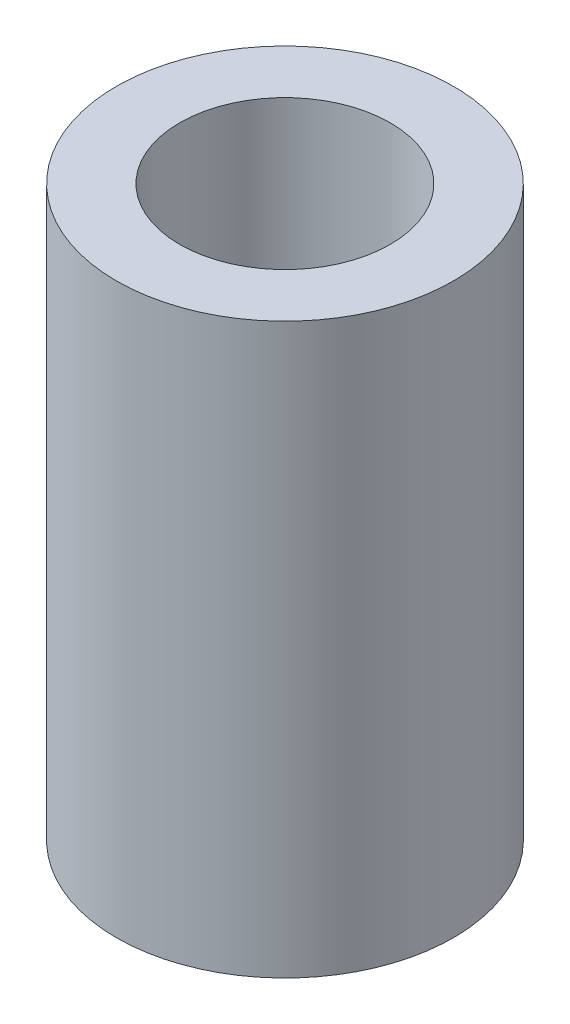
ISO-10303-21;
HEADER;
FILE_DESCRIPTION(('STEP AP214'),'2;1');
FILE_NAME('part.step','',(''),(''),'','','');
FILE_SCHEMA(('AUTOMOTIVE_DESIGN { 1 0 10303 214 1 1 1 1 }'));
ENDSEC;
DATA;
#1=APPLICATION_CONTEXT('core data for automotive mechanical design processes');
#2=APPLICATION_PROTOCOL_DEFINITION('international standard','automotive_design',2000,#1);
#3=PRODUCT_CONTEXT('',#1,'mechanical');
#4=PRODUCT('Part','Part','',(#3));
#5=PRODUCT_RELATED_PRODUCT_CATEGORY('part','',(#4));
#6=PRODUCT_DEFINITION_FORMATION('','',#4);
#7=PRODUCT_DEFINITION_CONTEXT('part definition',#1,'design');
#8=PRODUCT_DEFINITION('design','',#6,#7);
#9=PRODUCT_DEFINITION_SHAPE('','',#8);
#10=(LENGTH_UNIT() NAMED_UNIT(*) SI_UNIT(.MILLI.,.METRE.));
#11=(NAMED_UNIT(*) PLANE_ANGLE_UNIT() SI_UNIT($,.RADIAN.));
#12=(NAMED_UNIT(*) SI_UNIT($,.STERADIAN.) SOLID_ANGLE_UNIT());
#13=UNCERTAINTY_MEASURE_WITH_UNIT(LENGTH_MEASURE(1.E-05),#10,'distance_accuracy_value','');
#14=(GEOMETRIC_REPRESENTATION_CONTEXT(3) GLOBAL_UNCERTAINTY_ASSIGNED_CONTEXT((#13)) GLOBAL_UNIT_ASSIGNED_CONTEXT((#10,
#11,#12)) REPRESENTATION_CONTEXT('',''));
#15=CARTESIAN_POINT('',(0.,0.,0.));
#16=DIRECTION('',(0.,0.,1.));
#17=DIRECTION('',(1.,0.,0.));
#18=AXIS2_PLACEMENT_3D('',#15,#16,#17);
#19=CARTESIAN_POINT('',(0.,13.5,0.));
#20=DIRECTION('',(0.,1.,0.));
#21=DIRECTION('',(0.,0.,1.));
#22=AXIS2_PLACEMENT_3D('',#19,#20,#21);
#23=PLANE('',#22);
#24=CARTESIAN_POINT('',(0.,13.5,0.));
#25=DIRECTION('',(0.,1.,0.));
#26=DIRECTION('',(0.,0.,1.));
#27=AXIS2_PLACEMENT_3D('',#24,#25,#26);
#28=CIRCLE('',#27,4.);
#29=CARTESIAN_POINT('',(0.,13.5,4.));
#30=VERTEX_POINT('',#29);
#31=EDGE_CURVE('E10',#30,#30,#28,.T.);
#32=ORIENTED_EDGE('',*,*,#31,.T.);
#33=EDGE_LOOP('',(#32));
#34=FACE_BOUND('',#33,.T.);
#35=CARTESIAN_POINT('',(0.,13.5,0.));
#36=DIRECTION('',(0.,1.,0.));
#37=DIRECTION('',(0.,0.,1.));
#38=AXIS2_PLACEMENT_3D('',#35,#36,#37);
#39=CIRCLE('',#38,2.5);
#40=CARTESIAN_POINT('',(0.,13.5,2.5));
#41=VERTEX_POINT('',#40);
#42=EDGE_CURVE('E50',#41,#41,#39,.T.);
#43=ORIENTED_EDGE('',*,*,#42,.F.);
#44=EDGE_LOOP('',(#43));
#45=FACE_BOUND('',#44,.T.);
#46=ADVANCED_FACE('F37',(#34,#45),#23,.T.);
#47=CARTESIAN_POINT('',(0.,0.,0.));
#48=DIRECTION('',(0.,1.,0.));
#49=DIRECTION('',(0.,0.,1.));
#50=AXIS2_PLACEMENT_3D('',#47,#48,#49);
#51=PLANE('',#50);
#52=CARTESIAN_POINT('',(0.,0.,0.));
#53=DIRECTION('',(0.,1.,0.));
#54=DIRECTION('',(0.,0.,1.));
#55=AXIS2_PLACEMENT_3D('',#52,#53,#54);
#56=CIRCLE('',#55,4.);
#57=CARTESIAN_POINT('',(0.,0.,4.));
#58=VERTEX_POINT('',#57);
#59=EDGE_CURVE('E41',#58,#58,#56,.T.);
#60=ORIENTED_EDGE('',*,*,#59,.F.);
#61=EDGE_LOOP('',(#60));
#62=FACE_BOUND('',#61,.T.);
#63=CARTESIAN_POINT('',(0.,0.,0.));
#64=DIRECTION('',(0.,1.,0.));
#65=DIRECTION('',(0.,0.,1.));
#66=AXIS2_PLACEMENT_3D('',#63,#64,#65);
#67=CIRCLE('',#66,2.5);
#68=CARTESIAN_POINT('',(0.,0.,2.5));
#69=VERTEX_POINT('',#68);
#70=EDGE_CURVE('E52',#69,#69,#67,.T.);
#71=ORIENTED_EDGE('',*,*,#70,.T.);
#72=EDGE_LOOP('',(#71));
#73=FACE_BOUND('',#72,.T.);
#74=ADVANCED_FACE('F64',(#62,#73),#51,.F.);
#75=CARTESIAN_POINT('',(0.,13.5,0.));
#76=DIRECTION('',(0.,-1.,0.));
#77=DIRECTION('',(0.,0.,-1.));
#78=AXIS2_PLACEMENT_3D('',#75,#76,#77);
#79=CYLINDRICAL_SURFACE('',#78,4.);
#80=ORIENTED_EDGE('',*,*,#31,.F.);
#81=EDGE_LOOP('',(#80));
#82=FACE_BOUND('',#81,.T.);
#83=ORIENTED_EDGE('',*,*,#59,.T.);
#84=EDGE_LOOP('',(#83));
#85=FACE_BOUND('',#84,.T.);
#86=ADVANCED_FACE('F39',(#82,#85),#79,.T.);
#87=CARTESIAN_POINT('',(0.,13.5,0.));
#88=DIRECTION('',(0.,-1.,0.));
#89=DIRECTION('',(0.,0.,-1.));
#90=AXIS2_PLACEMENT_3D('',#87,#88,#89);
#91=CYLINDRICAL_SURFACE('',#90,2.5);
#92=ORIENTED_EDGE('',*,*,#42,.T.);
#93=EDGE_LOOP('',(#92));
#94=FACE_BOUND('',#93,.T.);
#95=ORIENTED_EDGE('',*,*,#70,.F.);
#96=EDGE_LOOP('',(#95));
#97=FACE_BOUND('',#96,.T.);
#98=ADVANCED_FACE('F60',(#94,#97),#91,.F.);
#99=CLOSED_SHELL('',(#46,#74,#86,#98));
#100=MANIFOLD_SOLID_BREP('B2',#99);
#101=ADVANCED_BREP_SHAPE_REPRESENTATION('',(#18,#100),#14);
#102=SHAPE_DEFINITION_REPRESENTATION(#9,#101);
ENDSEC;
END-ISO-10303-21;
